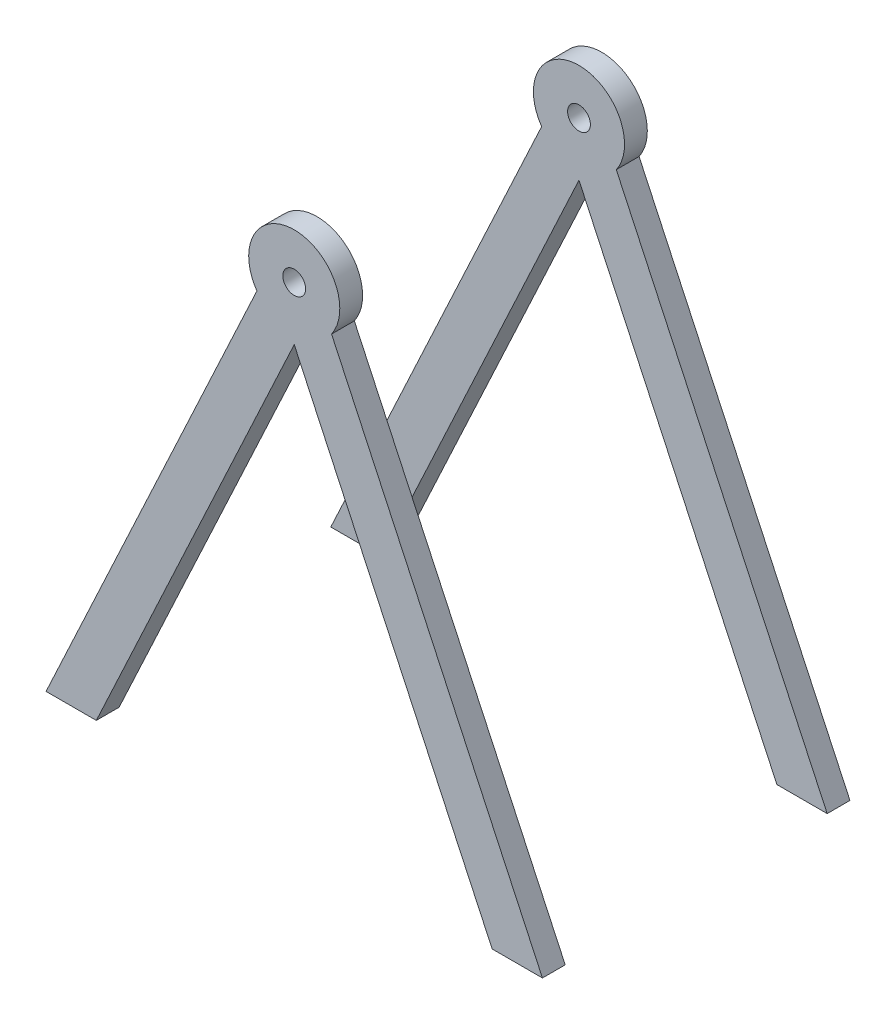
ISO-10303-21;
HEADER;
FILE_DESCRIPTION(('STEP AP214'),'2;1');
FILE_NAME('part.step','',(''),(''),'','','');
FILE_SCHEMA(('AUTOMOTIVE_DESIGN { 1 0 10303 214 1 1 1 1 }'));
ENDSEC;
DATA;
#1=APPLICATION_CONTEXT('core data for automotive mechanical design processes');
#2=APPLICATION_PROTOCOL_DEFINITION('international standard','automotive_design',2000,#1);
#3=PRODUCT_CONTEXT('',#1,'mechanical');
#4=PRODUCT('Part','Part','',(#3));
#5=PRODUCT_RELATED_PRODUCT_CATEGORY('part','',(#4));
#6=PRODUCT_DEFINITION_FORMATION('','',#4);
#7=PRODUCT_DEFINITION_CONTEXT('part definition',#1,'design');
#8=PRODUCT_DEFINITION('design','',#6,#7);
#9=PRODUCT_DEFINITION_SHAPE('','',#8);
#10=(LENGTH_UNIT() NAMED_UNIT(*) SI_UNIT(.MILLI.,.METRE.));
#11=(NAMED_UNIT(*) PLANE_ANGLE_UNIT() SI_UNIT($,.RADIAN.));
#12=(NAMED_UNIT(*) SI_UNIT($,.STERADIAN.) SOLID_ANGLE_UNIT());
#13=UNCERTAINTY_MEASURE_WITH_UNIT(LENGTH_MEASURE(1.E-05),#10,'distance_accuracy_value','');
#14=(GEOMETRIC_REPRESENTATION_CONTEXT(3) GLOBAL_UNCERTAINTY_ASSIGNED_CONTEXT((#13)) GLOBAL_UNIT_ASSIGNED_CONTEXT((#10,
#11,#12)) REPRESENTATION_CONTEXT('',''));
#15=CARTESIAN_POINT('',(0.,0.,0.));
#16=DIRECTION('',(0.,0.,1.));
#17=DIRECTION('',(1.,0.,0.));
#18=AXIS2_PLACEMENT_3D('',#15,#16,#17);
#19=CARTESIAN_POINT('',(0.,210.,-125.));
#20=DIRECTION('',(0.,0.,-1.));
#21=DIRECTION('',(1.,0.,0.));
#22=AXIS2_PLACEMENT_3D('',#19,#20,#21);
#23=PLANE('',#22);
#24=DIRECTION('',(0.422618261740694,-0.906307787036653,0.));
#25=VECTOR('',#24,1.);
#26=CARTESIAN_POINT('',(0.,186.337984168475,-125.));
#27=LINE('',#26,#25);
#28=CARTESIAN_POINT('',(0.,186.337984168475,-125.));
#29=VERTEX_POINT('',#28);
#30=CARTESIAN_POINT('',(86.8908290229232,0.,-125.));
#31=VERTEX_POINT('',#30);
#32=EDGE_CURVE('E153',#29,#31,#27,.T.);
#33=ORIENTED_EDGE('',*,*,#32,.F.);
#34=DIRECTION('',(0.422618261740694,0.906307787036653,0.));
#35=VECTOR('',#34,1.);
#36=CARTESIAN_POINT('',(0.,186.337984168475,-125.));
#37=LINE('',#36,#35);
#38=CARTESIAN_POINT('',(-86.8908290229232,0.,-125.));
#39=VERTEX_POINT('',#38);
#40=EDGE_CURVE('E130',#39,#29,#37,.T.);
#41=ORIENTED_EDGE('',*,*,#40,.F.);
#42=DIRECTION('',(1.,0.,0.));
#43=VECTOR('',#42,1.);
#44=CARTESIAN_POINT('',(-108.958387402173,0.,-125.));
#45=LINE('',#44,#43);
#46=CARTESIAN_POINT('',(-108.958387402173,0.,-125.));
#47=VERTEX_POINT('',#46);
#48=EDGE_CURVE('E111',#47,#39,#45,.T.);
#49=ORIENTED_EDGE('',*,*,#48,.F.);
#50=DIRECTION('',(-0.422618261740694,-0.906307787036653,0.));
#51=VECTOR('',#50,1.);
#52=CARTESIAN_POINT('',(-16.3830408857798,198.528471272979,-125.));
#53=LINE('',#52,#51);
#54=CARTESIAN_POINT('',(-16.3830408857798,198.528471272979,-125.));
#55=VERTEX_POINT('',#54);
#56=EDGE_CURVE('E121',#55,#47,#53,.T.);
#57=ORIENTED_EDGE('',*,*,#56,.F.);
#58=CARTESIAN_POINT('',(0.,210.,-125.));
#59=DIRECTION('',(0.,0.,1.));
#60=DIRECTION('',(1.,0.,0.));
#61=AXIS2_PLACEMENT_3D('',#58,#59,#60);
#62=CIRCLE('',#61,20.);
#63=CARTESIAN_POINT('',(16.3830408857798,198.528471272979,-125.));
#64=VERTEX_POINT('',#63);
#65=EDGE_CURVE('E126',#64,#55,#62,.T.);
#66=ORIENTED_EDGE('',*,*,#65,.F.);
#67=DIRECTION('',(-0.422618261740694,0.906307787036653,0.));
#68=VECTOR('',#67,1.);
#69=CARTESIAN_POINT('',(16.3830408857798,198.528471272979,-125.));
#70=LINE('',#69,#68);
#71=CARTESIAN_POINT('',(108.958387402173,0.,-125.));
#72=VERTEX_POINT('',#71);
#73=EDGE_CURVE('E170',#72,#64,#70,.T.);
#74=ORIENTED_EDGE('',*,*,#73,.F.);
#75=DIRECTION('',(1.,0.,0.));
#76=VECTOR('',#75,1.);
#77=CARTESIAN_POINT('',(108.958387402173,0.,-125.));
#78=LINE('',#77,#76);
#79=EDGE_CURVE('E160',#31,#72,#78,.T.);
#80=ORIENTED_EDGE('',*,*,#79,.F.);
#81=EDGE_LOOP('',(#33,#41,#49,#57,#66,#74,#80));
#82=FACE_BOUND('',#81,.T.);
#83=CARTESIAN_POINT('',(0.,210.,-125.));
#84=DIRECTION('',(0.,0.,1.));
#85=DIRECTION('',(1.,0.,0.));
#86=AXIS2_PLACEMENT_3D('',#83,#84,#85);
#87=CIRCLE('',#86,5.00000000000001);
#88=CARTESIAN_POINT('',(5.00000000000001,210.,-125.));
#89=VERTEX_POINT('',#88);
#90=EDGE_CURVE('E139',#89,#89,#87,.T.);
#91=ORIENTED_EDGE('',*,*,#90,.T.);
#92=EDGE_LOOP('',(#91));
#93=FACE_BOUND('',#92,.T.);
#94=ADVANCED_FACE('F44',(#82,#93),#23,.T.);
#95=CARTESIAN_POINT('',(0.,210.,-115.));
#96=DIRECTION('',(0.,0.,-1.));
#97=DIRECTION('',(1.,0.,0.));
#98=AXIS2_PLACEMENT_3D('',#95,#96,#97);
#99=PLANE('',#98);
#100=DIRECTION('',(0.422618261740694,-0.906307787036653,0.));
#101=VECTOR('',#100,1.);
#102=CARTESIAN_POINT('',(0.,186.337984168475,-115.));
#103=LINE('',#102,#101);
#104=CARTESIAN_POINT('',(0.,186.337984168475,-115.));
#105=VERTEX_POINT('',#104);
#106=CARTESIAN_POINT('',(86.8908290229232,0.,-115.));
#107=VERTEX_POINT('',#106);
#108=EDGE_CURVE('E135',#105,#107,#103,.T.);
#109=ORIENTED_EDGE('',*,*,#108,.T.);
#110=DIRECTION('',(1.,0.,0.));
#111=VECTOR('',#110,1.);
#112=CARTESIAN_POINT('',(108.958387402173,0.,-115.));
#113=LINE('',#112,#111);
#114=CARTESIAN_POINT('',(108.958387402173,0.,-115.));
#115=VERTEX_POINT('',#114);
#116=EDGE_CURVE('E138',#107,#115,#113,.T.);
#117=ORIENTED_EDGE('',*,*,#116,.T.);
#118=DIRECTION('',(-0.422618261740694,0.906307787036653,0.));
#119=VECTOR('',#118,1.);
#120=CARTESIAN_POINT('',(16.3830408857798,198.528471272979,-115.));
#121=LINE('',#120,#119);
#122=CARTESIAN_POINT('',(16.3830408857798,198.528471272979,-115.));
#123=VERTEX_POINT('',#122);
#124=EDGE_CURVE('E142',#115,#123,#121,.T.);
#125=ORIENTED_EDGE('',*,*,#124,.T.);
#126=CARTESIAN_POINT('',(0.,210.,-115.));
#127=DIRECTION('',(0.,0.,1.));
#128=DIRECTION('',(1.,0.,0.));
#129=AXIS2_PLACEMENT_3D('',#126,#127,#128);
#130=CIRCLE('',#129,20.);
#131=CARTESIAN_POINT('',(-16.3830408857798,198.528471272979,-115.));
#132=VERTEX_POINT('',#131);
#133=EDGE_CURVE('E145',#123,#132,#130,.T.);
#134=ORIENTED_EDGE('',*,*,#133,.T.);
#135=DIRECTION('',(-0.422618261740694,-0.906307787036653,0.));
#136=VECTOR('',#135,1.);
#137=CARTESIAN_POINT('',(-16.3830408857798,198.528471272979,-115.));
#138=LINE('',#137,#136);
#139=CARTESIAN_POINT('',(-108.958387402173,0.,-115.));
#140=VERTEX_POINT('',#139);
#141=EDGE_CURVE('E148',#132,#140,#138,.T.);
#142=ORIENTED_EDGE('',*,*,#141,.T.);
#143=DIRECTION('',(1.,0.,0.));
#144=VECTOR('',#143,1.);
#145=CARTESIAN_POINT('',(-108.958387402173,0.,-115.));
#146=LINE('',#145,#144);
#147=CARTESIAN_POINT('',(-86.8908290229232,0.,-115.));
#148=VERTEX_POINT('',#147);
#149=EDGE_CURVE('E114',#140,#148,#146,.T.);
#150=ORIENTED_EDGE('',*,*,#149,.T.);
#151=DIRECTION('',(0.422618261740694,0.906307787036653,0.));
#152=VECTOR('',#151,1.);
#153=CARTESIAN_POINT('',(0.,186.337984168475,-115.));
#154=LINE('',#153,#152);
#155=EDGE_CURVE('E151',#148,#105,#154,.T.);
#156=ORIENTED_EDGE('',*,*,#155,.T.);
#157=EDGE_LOOP('',(#109,#117,#125,#134,#142,#150,#156));
#158=FACE_BOUND('',#157,.T.);
#159=CARTESIAN_POINT('',(0.,210.,-115.));
#160=DIRECTION('',(0.,0.,1.));
#161=DIRECTION('',(1.,0.,0.));
#162=AXIS2_PLACEMENT_3D('',#159,#160,#161);
#163=CIRCLE('',#162,5.00000000000001);
#164=CARTESIAN_POINT('',(5.00000000000001,210.,-115.));
#165=VERTEX_POINT('',#164);
#166=EDGE_CURVE('E173',#165,#165,#163,.T.);
#167=ORIENTED_EDGE('',*,*,#166,.F.);
#168=EDGE_LOOP('',(#167));
#169=FACE_BOUND('',#168,.T.);
#170=ADVANCED_FACE('F167',(#158,#169),#99,.F.);
#171=CARTESIAN_POINT('',(0.,186.337984168475,-125.));
#172=DIRECTION('',(0.906307787036653,0.422618261740694,0.));
#173=DIRECTION('',(-0.422618261740694,0.906307787036653,0.));
#174=AXIS2_PLACEMENT_3D('',#171,#172,#173);
#175=PLANE('',#174);
#176=ORIENTED_EDGE('',*,*,#108,.F.);
#177=DIRECTION('',(0.,0.,1.));
#178=VECTOR('',#177,1.);
#179=CARTESIAN_POINT('',(0.,186.337984168475,-125.));
#180=LINE('',#179,#178);
#181=EDGE_CURVE('E61',#29,#105,#180,.T.);
#182=ORIENTED_EDGE('',*,*,#181,.F.);
#183=ORIENTED_EDGE('',*,*,#32,.T.);
#184=DIRECTION('',(0.,0.,1.));
#185=VECTOR('',#184,1.);
#186=CARTESIAN_POINT('',(86.8908290229232,0.,-125.));
#187=LINE('',#186,#185);
#188=EDGE_CURVE('E12',#31,#107,#187,.T.);
#189=ORIENTED_EDGE('',*,*,#188,.T.);
#190=EDGE_LOOP('',(#176,#182,#183,#189));
#191=FACE_BOUND('',#190,.T.);
#192=ADVANCED_FACE('F46',(#191),#175,.F.);
#193=CARTESIAN_POINT('',(108.958387402173,0.,-125.));
#194=DIRECTION('',(0.,1.,0.));
#195=DIRECTION('',(-1.,0.,0.));
#196=AXIS2_PLACEMENT_3D('',#193,#194,#195);
#197=PLANE('',#196);
#198=ORIENTED_EDGE('',*,*,#116,.F.);
#199=ORIENTED_EDGE('',*,*,#188,.F.);
#200=ORIENTED_EDGE('',*,*,#79,.T.);
#201=DIRECTION('',(0.,0.,1.));
#202=VECTOR('',#201,1.);
#203=CARTESIAN_POINT('',(108.958387402173,0.,-125.));
#204=LINE('',#203,#202);
#205=EDGE_CURVE('E53',#72,#115,#204,.T.);
#206=ORIENTED_EDGE('',*,*,#205,.T.);
#207=EDGE_LOOP('',(#198,#199,#200,#206));
#208=FACE_BOUND('',#207,.T.);
#209=ADVANCED_FACE('F159',(#208),#197,.F.);
#210=CARTESIAN_POINT('',(16.3830408857798,198.528471272979,-125.));
#211=DIRECTION('',(-0.906307787036653,-0.422618261740694,0.));
#212=DIRECTION('',(0.422618261740694,-0.906307787036653,0.));
#213=AXIS2_PLACEMENT_3D('',#210,#211,#212);
#214=PLANE('',#213);
#215=ORIENTED_EDGE('',*,*,#124,.F.);
#216=ORIENTED_EDGE('',*,*,#205,.F.);
#217=ORIENTED_EDGE('',*,*,#73,.T.);
#218=DIRECTION('',(0.,0.,1.));
#219=VECTOR('',#218,1.);
#220=CARTESIAN_POINT('',(16.3830408857798,198.528471272979,-125.));
#221=LINE('',#220,#219);
#222=EDGE_CURVE('E157',#64,#123,#221,.T.);
#223=ORIENTED_EDGE('',*,*,#222,.T.);
#224=EDGE_LOOP('',(#215,#216,#217,#223));
#225=FACE_BOUND('',#224,.T.);
#226=ADVANCED_FACE('F164',(#225),#214,.F.);
#227=CARTESIAN_POINT('',(0.,210.,-125.));
#228=DIRECTION('',(0.,0.,1.));
#229=DIRECTION('',(-1.,0.,0.));
#230=AXIS2_PLACEMENT_3D('',#227,#228,#229);
#231=CYLINDRICAL_SURFACE('',#230,20.);
#232=ORIENTED_EDGE('',*,*,#133,.F.);
#233=ORIENTED_EDGE('',*,*,#222,.F.);
#234=ORIENTED_EDGE('',*,*,#65,.T.);
#235=DIRECTION('',(0.,0.,1.));
#236=VECTOR('',#235,1.);
#237=CARTESIAN_POINT('',(-16.3830408857798,198.528471272979,-125.));
#238=LINE('',#237,#236);
#239=EDGE_CURVE('E118',#55,#132,#238,.T.);
#240=ORIENTED_EDGE('',*,*,#239,.T.);
#241=EDGE_LOOP('',(#232,#233,#234,#240));
#242=FACE_BOUND('',#241,.T.);
#243=ADVANCED_FACE('F177',(#242),#231,.T.);
#244=CARTESIAN_POINT('',(-16.3830408857798,198.528471272979,-125.));
#245=DIRECTION('',(0.906307787036653,-0.422618261740694,0.));
#246=DIRECTION('',(0.422618261740694,0.906307787036653,0.));
#247=AXIS2_PLACEMENT_3D('',#244,#245,#246);
#248=PLANE('',#247);
#249=ORIENTED_EDGE('',*,*,#141,.F.);
#250=ORIENTED_EDGE('',*,*,#239,.F.);
#251=ORIENTED_EDGE('',*,*,#56,.T.);
#252=DIRECTION('',(0.,0.,1.));
#253=VECTOR('',#252,1.);
#254=CARTESIAN_POINT('',(-108.958387402173,0.,-125.));
#255=LINE('',#254,#253);
#256=EDGE_CURVE('E107',#47,#140,#255,.T.);
#257=ORIENTED_EDGE('',*,*,#256,.T.);
#258=EDGE_LOOP('',(#249,#250,#251,#257));
#259=FACE_BOUND('',#258,.T.);
#260=ADVANCED_FACE('F122',(#259),#248,.F.);
#261=CARTESIAN_POINT('',(-108.958387402173,0.,-125.));
#262=DIRECTION('',(0.,1.,0.));
#263=DIRECTION('',(-1.,0.,0.));
#264=AXIS2_PLACEMENT_3D('',#261,#262,#263);
#265=PLANE('',#264);
#266=ORIENTED_EDGE('',*,*,#149,.F.);
#267=ORIENTED_EDGE('',*,*,#256,.F.);
#268=ORIENTED_EDGE('',*,*,#48,.T.);
#269=DIRECTION('',(0.,0.,1.));
#270=VECTOR('',#269,1.);
#271=CARTESIAN_POINT('',(-86.8908290229232,0.,-125.));
#272=LINE('',#271,#270);
#273=EDGE_CURVE('E86',#39,#148,#272,.T.);
#274=ORIENTED_EDGE('',*,*,#273,.T.);
#275=EDGE_LOOP('',(#266,#267,#268,#274));
#276=FACE_BOUND('',#275,.T.);
#277=ADVANCED_FACE('F109',(#276),#265,.F.);
#278=CARTESIAN_POINT('',(0.,186.337984168475,-125.));
#279=DIRECTION('',(-0.906307787036653,0.422618261740694,0.));
#280=DIRECTION('',(-0.422618261740694,-0.906307787036653,0.));
#281=AXIS2_PLACEMENT_3D('',#278,#279,#280);
#282=PLANE('',#281);
#283=ORIENTED_EDGE('',*,*,#155,.F.);
#284=ORIENTED_EDGE('',*,*,#273,.F.);
#285=ORIENTED_EDGE('',*,*,#40,.T.);
#286=ORIENTED_EDGE('',*,*,#181,.T.);
#287=EDGE_LOOP('',(#283,#284,#285,#286));
#288=FACE_BOUND('',#287,.T.);
#289=ADVANCED_FACE('F195',(#288),#282,.F.);
#290=CARTESIAN_POINT('',(0.,210.,-125.));
#291=DIRECTION('',(0.,0.,1.));
#292=DIRECTION('',(-1.,0.,0.));
#293=AXIS2_PLACEMENT_3D('',#290,#291,#292);
#294=CYLINDRICAL_SURFACE('',#293,5.00000000000001);
#295=ORIENTED_EDGE('',*,*,#90,.F.);
#296=EDGE_LOOP('',(#295));
#297=FACE_BOUND('',#296,.T.);
#298=ORIENTED_EDGE('',*,*,#166,.T.);
#299=EDGE_LOOP('',(#298));
#300=FACE_BOUND('',#299,.T.);
#301=ADVANCED_FACE('F193',(#297,#300),#294,.F.);
#302=CLOSED_SHELL('',(#94,#170,#192,#209,#226,#243,#260,#277,#289,#301));
#303=MANIFOLD_SOLID_BREP('B2',#302);
#304=CARTESIAN_POINT('',(0.,210.,10.));
#305=DIRECTION('',(0.,0.,1.));
#306=DIRECTION('',(1.,0.,0.));
#307=AXIS2_PLACEMENT_3D('',#304,#305,#306);
#308=PLANE('',#307);
#309=DIRECTION('',(0.422618261740694,-0.906307787036653,0.));
#310=VECTOR('',#309,1.);
#311=CARTESIAN_POINT('',(0.,186.337984168475,10.));
#312=LINE('',#311,#310);
#313=CARTESIAN_POINT('',(0.,186.337984168475,10.));
#314=VERTEX_POINT('',#313);
#315=CARTESIAN_POINT('',(86.8908290229232,0.,10.));
#316=VERTEX_POINT('',#315);
#317=EDGE_CURVE('E370',#314,#316,#312,.T.);
#318=ORIENTED_EDGE('',*,*,#317,.T.);
#319=DIRECTION('',(1.,0.,0.));
#320=VECTOR('',#319,1.);
#321=CARTESIAN_POINT('',(108.958387402173,0.,10.));
#322=LINE('',#321,#320);
#323=CARTESIAN_POINT('',(108.958387402173,0.,10.));
#324=VERTEX_POINT('',#323);
#325=EDGE_CURVE('E323',#316,#324,#322,.T.);
#326=ORIENTED_EDGE('',*,*,#325,.T.);
#327=DIRECTION('',(-0.422618261740694,0.906307787036653,0.));
#328=VECTOR('',#327,1.);
#329=CARTESIAN_POINT('',(16.3830408857798,198.528471272979,10.));
#330=LINE('',#329,#328);
#331=CARTESIAN_POINT('',(16.3830408857798,198.528471272979,10.));
#332=VERTEX_POINT('',#331);
#333=EDGE_CURVE('E382',#324,#332,#330,.T.);
#334=ORIENTED_EDGE('',*,*,#333,.T.);
#335=CARTESIAN_POINT('',(0.,210.,10.));
#336=DIRECTION('',(0.,0.,1.));
#337=DIRECTION('',(1.,0.,0.));
#338=AXIS2_PLACEMENT_3D('',#335,#336,#337);
#339=CIRCLE('',#338,20.);
#340=CARTESIAN_POINT('',(-16.3830408857798,198.528471272979,10.));
#341=VERTEX_POINT('',#340);
#342=EDGE_CURVE('E339',#332,#341,#339,.T.);
#343=ORIENTED_EDGE('',*,*,#342,.T.);
#344=DIRECTION('',(-0.422618261740694,-0.906307787036653,0.));
#345=VECTOR('',#344,1.);
#346=CARTESIAN_POINT('',(-16.3830408857798,198.528471272979,10.));
#347=LINE('',#346,#345);
#348=CARTESIAN_POINT('',(-108.958387402173,0.,10.));
#349=VERTEX_POINT('',#348);
#350=EDGE_CURVE('E333',#341,#349,#347,.T.);
#351=ORIENTED_EDGE('',*,*,#350,.T.);
#352=DIRECTION('',(1.,0.,0.));
#353=VECTOR('',#352,1.);
#354=CARTESIAN_POINT('',(-108.958387402173,0.,10.));
#355=LINE('',#354,#353);
#356=CARTESIAN_POINT('',(-86.8908290229232,0.,10.));
#357=VERTEX_POINT('',#356);
#358=EDGE_CURVE('E337',#349,#357,#355,.T.);
#359=ORIENTED_EDGE('',*,*,#358,.T.);
#360=DIRECTION('',(0.422618261740694,0.906307787036653,0.));
#361=VECTOR('',#360,1.);
#362=CARTESIAN_POINT('',(0.,186.337984168475,10.));
#363=LINE('',#362,#361);
#364=EDGE_CURVE('E283',#357,#314,#363,.T.);
#365=ORIENTED_EDGE('',*,*,#364,.T.);
#366=EDGE_LOOP('',(#318,#326,#334,#343,#351,#359,#365));
#367=FACE_BOUND('',#366,.T.);
#368=CARTESIAN_POINT('',(0.,210.,10.));
#369=DIRECTION('',(0.,0.,1.));
#370=DIRECTION('',(1.,0.,0.));
#371=AXIS2_PLACEMENT_3D('',#368,#369,#370);
#372=CIRCLE('',#371,5.00000000000001);
#373=CARTESIAN_POINT('',(5.00000000000001,210.,10.));
#374=VERTEX_POINT('',#373);
#375=EDGE_CURVE('E361',#374,#374,#372,.T.);
#376=ORIENTED_EDGE('',*,*,#375,.F.);
#377=EDGE_LOOP('',(#376));
#378=FACE_BOUND('',#377,.T.);
#379=ADVANCED_FACE('F266',(#367,#378),#308,.T.);
#380=CARTESIAN_POINT('',(0.,210.,0.));
#381=DIRECTION('',(0.,0.,1.));
#382=DIRECTION('',(1.,0.,0.));
#383=AXIS2_PLACEMENT_3D('',#380,#381,#382);
#384=PLANE('',#383);
#385=DIRECTION('',(0.422618261740694,-0.906307787036653,0.));
#386=VECTOR('',#385,1.);
#387=CARTESIAN_POINT('',(0.,186.337984168475,0.));
#388=LINE('',#387,#386);
#389=CARTESIAN_POINT('',(0.,186.337984168475,0.));
#390=VERTEX_POINT('',#389);
#391=CARTESIAN_POINT('',(86.8908290229232,0.,0.));
#392=VERTEX_POINT('',#391);
#393=EDGE_CURVE('E357',#390,#392,#388,.T.);
#394=ORIENTED_EDGE('',*,*,#393,.F.);
#395=DIRECTION('',(0.422618261740694,0.906307787036653,0.));
#396=VECTOR('',#395,1.);
#397=CARTESIAN_POINT('',(0.,186.337984168475,0.));
#398=LINE('',#397,#396);
#399=CARTESIAN_POINT('',(-86.8908290229232,0.,0.));
#400=VERTEX_POINT('',#399);
#401=EDGE_CURVE('E315',#400,#390,#398,.T.);
#402=ORIENTED_EDGE('',*,*,#401,.F.);
#403=DIRECTION('',(1.,0.,0.));
#404=VECTOR('',#403,1.);
#405=CARTESIAN_POINT('',(-108.958387402173,0.,0.));
#406=LINE('',#405,#404);
#407=CARTESIAN_POINT('',(-108.958387402173,0.,0.));
#408=VERTEX_POINT('',#407);
#409=EDGE_CURVE('E309',#408,#400,#406,.T.);
#410=ORIENTED_EDGE('',*,*,#409,.F.);
#411=DIRECTION('',(-0.422618261740694,-0.906307787036653,0.));
#412=VECTOR('',#411,1.);
#413=CARTESIAN_POINT('',(-16.3830408857798,198.528471272979,0.));
#414=LINE('',#413,#412);
#415=CARTESIAN_POINT('',(-16.3830408857798,198.528471272979,0.));
#416=VERTEX_POINT('',#415);
#417=EDGE_CURVE('E347',#416,#408,#414,.T.);
#418=ORIENTED_EDGE('',*,*,#417,.F.);
#419=CARTESIAN_POINT('',(0.,210.,0.));
#420=DIRECTION('',(0.,0.,1.));
#421=DIRECTION('',(1.,0.,0.));
#422=AXIS2_PLACEMENT_3D('',#419,#420,#421);
#423=CIRCLE('',#422,20.);
#424=CARTESIAN_POINT('',(16.3830408857798,198.528471272979,0.));
#425=VERTEX_POINT('',#424);
#426=EDGE_CURVE('E365',#425,#416,#423,.T.);
#427=ORIENTED_EDGE('',*,*,#426,.F.);
#428=DIRECTION('',(-0.422618261740694,0.906307787036653,0.));
#429=VECTOR('',#428,1.);
#430=CARTESIAN_POINT('',(16.3830408857798,198.528471272979,0.));
#431=LINE('',#430,#429);
#432=CARTESIAN_POINT('',(108.958387402173,0.,0.));
#433=VERTEX_POINT('',#432);
#434=EDGE_CURVE('E363',#433,#425,#431,.T.);
#435=ORIENTED_EDGE('',*,*,#434,.F.);
#436=DIRECTION('',(1.,0.,0.));
#437=VECTOR('',#436,1.);
#438=CARTESIAN_POINT('',(108.958387402173,0.,0.));
#439=LINE('',#438,#437);
#440=EDGE_CURVE('E360',#392,#433,#439,.T.);
#441=ORIENTED_EDGE('',*,*,#440,.F.);
#442=EDGE_LOOP('',(#394,#402,#410,#418,#427,#435,#441));
#443=FACE_BOUND('',#442,.T.);
#444=CARTESIAN_POINT('',(0.,210.,0.));
#445=DIRECTION('',(0.,0.,1.));
#446=DIRECTION('',(1.,0.,0.));
#447=AXIS2_PLACEMENT_3D('',#444,#445,#446);
#448=CIRCLE('',#447,5.00000000000001);
#449=CARTESIAN_POINT('',(5.00000000000001,210.,0.));
#450=VERTEX_POINT('',#449);
#451=EDGE_CURVE('E394',#450,#450,#448,.T.);
#452=ORIENTED_EDGE('',*,*,#451,.T.);
#453=EDGE_LOOP('',(#452));
#454=FACE_BOUND('',#453,.T.);
#455=ADVANCED_FACE('F386',(#443,#454),#384,.F.);
#456=CARTESIAN_POINT('',(0.,186.337984168475,10.));
#457=DIRECTION('',(0.906307787036653,0.422618261740694,0.));
#458=DIRECTION('',(-0.422618261740694,0.906307787036653,0.));
#459=AXIS2_PLACEMENT_3D('',#456,#457,#458);
#460=PLANE('',#459);
#461=ORIENTED_EDGE('',*,*,#393,.T.);
#462=DIRECTION('',(0.,0.,-1.));
#463=VECTOR('',#462,1.);
#464=CARTESIAN_POINT('',(86.8908290229232,0.,10.));
#465=LINE('',#464,#463);
#466=EDGE_CURVE('E42',#316,#392,#465,.T.);
#467=ORIENTED_EDGE('',*,*,#466,.F.);
#468=ORIENTED_EDGE('',*,*,#317,.F.);
#469=DIRECTION('',(0.,0.,-1.));
#470=VECTOR('',#469,1.);
#471=CARTESIAN_POINT('',(0.,186.337984168475,10.));
#472=LINE('',#471,#470);
#473=EDGE_CURVE('E353',#314,#390,#472,.T.);
#474=ORIENTED_EDGE('',*,*,#473,.T.);
#475=EDGE_LOOP('',(#461,#467,#468,#474));
#476=FACE_BOUND('',#475,.T.);
#477=ADVANCED_FACE('F268',(#476),#460,.F.);
#478=CARTESIAN_POINT('',(108.958387402173,0.,10.));
#479=DIRECTION('',(0.,1.,0.));
#480=DIRECTION('',(-1.,0.,0.));
#481=AXIS2_PLACEMENT_3D('',#478,#479,#480);
#482=PLANE('',#481);
#483=ORIENTED_EDGE('',*,*,#440,.T.);
#484=DIRECTION('',(0.,0.,-1.));
#485=VECTOR('',#484,1.);
#486=CARTESIAN_POINT('',(108.958387402173,0.,10.));
#487=LINE('',#486,#485);
#488=EDGE_CURVE('E275',#324,#433,#487,.T.);
#489=ORIENTED_EDGE('',*,*,#488,.F.);
#490=ORIENTED_EDGE('',*,*,#325,.F.);
#491=ORIENTED_EDGE('',*,*,#466,.T.);
#492=EDGE_LOOP('',(#483,#489,#490,#491));
#493=FACE_BOUND('',#492,.T.);
#494=ADVANCED_FACE('F420',(#493),#482,.F.);
#495=CARTESIAN_POINT('',(16.3830408857798,198.528471272979,10.));
#496=DIRECTION('',(-0.906307787036653,-0.422618261740694,0.));
#497=DIRECTION('',(0.422618261740694,-0.906307787036653,0.));
#498=AXIS2_PLACEMENT_3D('',#495,#496,#497);
#499=PLANE('',#498);
#500=ORIENTED_EDGE('',*,*,#434,.T.);
#501=DIRECTION('',(0.,0.,-1.));
#502=VECTOR('',#501,1.);
#503=CARTESIAN_POINT('',(16.3830408857798,198.528471272979,10.));
#504=LINE('',#503,#502);
#505=EDGE_CURVE('E374',#332,#425,#504,.T.);
#506=ORIENTED_EDGE('',*,*,#505,.F.);
#507=ORIENTED_EDGE('',*,*,#333,.F.);
#508=ORIENTED_EDGE('',*,*,#488,.T.);
#509=EDGE_LOOP('',(#500,#506,#507,#508));
#510=FACE_BOUND('',#509,.T.);
#511=ADVANCED_FACE('F380',(#510),#499,.F.);
#512=CARTESIAN_POINT('',(0.,210.,10.));
#513=DIRECTION('',(0.,0.,-1.));
#514=DIRECTION('',(-1.,0.,0.));
#515=AXIS2_PLACEMENT_3D('',#512,#513,#514);
#516=CYLINDRICAL_SURFACE('',#515,20.);
#517=ORIENTED_EDGE('',*,*,#426,.T.);
#518=DIRECTION('',(0.,0.,-1.));
#519=VECTOR('',#518,1.);
#520=CARTESIAN_POINT('',(-16.3830408857798,198.528471272979,10.));
#521=LINE('',#520,#519);
#522=EDGE_CURVE('E348',#341,#416,#521,.T.);
#523=ORIENTED_EDGE('',*,*,#522,.F.);
#524=ORIENTED_EDGE('',*,*,#342,.F.);
#525=ORIENTED_EDGE('',*,*,#505,.T.);
#526=EDGE_LOOP('',(#517,#523,#524,#525));
#527=FACE_BOUND('',#526,.T.);
#528=ADVANCED_FACE('F389',(#527),#516,.T.);
#529=CARTESIAN_POINT('',(-16.3830408857798,198.528471272979,10.));
#530=DIRECTION('',(0.906307787036653,-0.422618261740694,0.));
#531=DIRECTION('',(0.422618261740694,0.906307787036653,0.));
#532=AXIS2_PLACEMENT_3D('',#529,#530,#531);
#533=PLANE('',#532);
#534=ORIENTED_EDGE('',*,*,#417,.T.);
#535=DIRECTION('',(0.,0.,-1.));
#536=VECTOR('',#535,1.);
#537=CARTESIAN_POINT('',(-108.958387402173,0.,10.));
#538=LINE('',#537,#536);
#539=EDGE_CURVE('E344',#349,#408,#538,.T.);
#540=ORIENTED_EDGE('',*,*,#539,.F.);
#541=ORIENTED_EDGE('',*,*,#350,.F.);
#542=ORIENTED_EDGE('',*,*,#522,.T.);
#543=EDGE_LOOP('',(#534,#540,#541,#542));
#544=FACE_BOUND('',#543,.T.);
#545=ADVANCED_FACE('F345',(#544),#533,.F.);
#546=CARTESIAN_POINT('',(-108.958387402173,0.,10.));
#547=DIRECTION('',(0.,1.,0.));
#548=DIRECTION('',(-1.,0.,0.));
#549=AXIS2_PLACEMENT_3D('',#546,#547,#548);
#550=PLANE('',#549);
#551=ORIENTED_EDGE('',*,*,#409,.T.);
#552=DIRECTION('',(0.,0.,-1.));
#553=VECTOR('',#552,1.);
#554=CARTESIAN_POINT('',(-86.8908290229232,0.,10.));
#555=LINE('',#554,#553);
#556=EDGE_CURVE('E349',#357,#400,#555,.T.);
#557=ORIENTED_EDGE('',*,*,#556,.F.);
#558=ORIENTED_EDGE('',*,*,#358,.F.);
#559=ORIENTED_EDGE('',*,*,#539,.T.);
#560=EDGE_LOOP('',(#551,#557,#558,#559));
#561=FACE_BOUND('',#560,.T.);
#562=ADVANCED_FACE('F351',(#561),#550,.F.);
#563=CARTESIAN_POINT('',(0.,186.337984168475,10.));
#564=DIRECTION('',(-0.906307787036653,0.422618261740694,0.));
#565=DIRECTION('',(-0.422618261740694,-0.906307787036653,0.));
#566=AXIS2_PLACEMENT_3D('',#563,#564,#565);
#567=PLANE('',#566);
#568=ORIENTED_EDGE('',*,*,#401,.T.);
#569=ORIENTED_EDGE('',*,*,#473,.F.);
#570=ORIENTED_EDGE('',*,*,#364,.F.);
#571=ORIENTED_EDGE('',*,*,#556,.T.);
#572=EDGE_LOOP('',(#568,#569,#570,#571));
#573=FACE_BOUND('',#572,.T.);
#574=ADVANCED_FACE('F410',(#573),#567,.F.);
#575=CARTESIAN_POINT('',(0.,210.,10.));
#576=DIRECTION('',(0.,0.,-1.));
#577=DIRECTION('',(-1.,0.,0.));
#578=AXIS2_PLACEMENT_3D('',#575,#576,#577);
#579=CYLINDRICAL_SURFACE('',#578,5.00000000000001);
#580=ORIENTED_EDGE('',*,*,#375,.T.);
#581=EDGE_LOOP('',(#580));
#582=FACE_BOUND('',#581,.T.);
#583=ORIENTED_EDGE('',*,*,#451,.F.);
#584=EDGE_LOOP('',(#583));
#585=FACE_BOUND('',#584,.T.);
#586=ADVANCED_FACE('F400',(#582,#585),#579,.F.);
#587=CLOSED_SHELL('',(#379,#455,#477,#494,#511,#528,#545,#562,#574,#586));
#588=MANIFOLD_SOLID_BREP('B6',#587);
#589=ADVANCED_BREP_SHAPE_REPRESENTATION('',(#18,#303,#588),#14);
#590=SHAPE_DEFINITION_REPRESENTATION(#9,#589);
ENDSEC;
END-ISO-10303-21;
